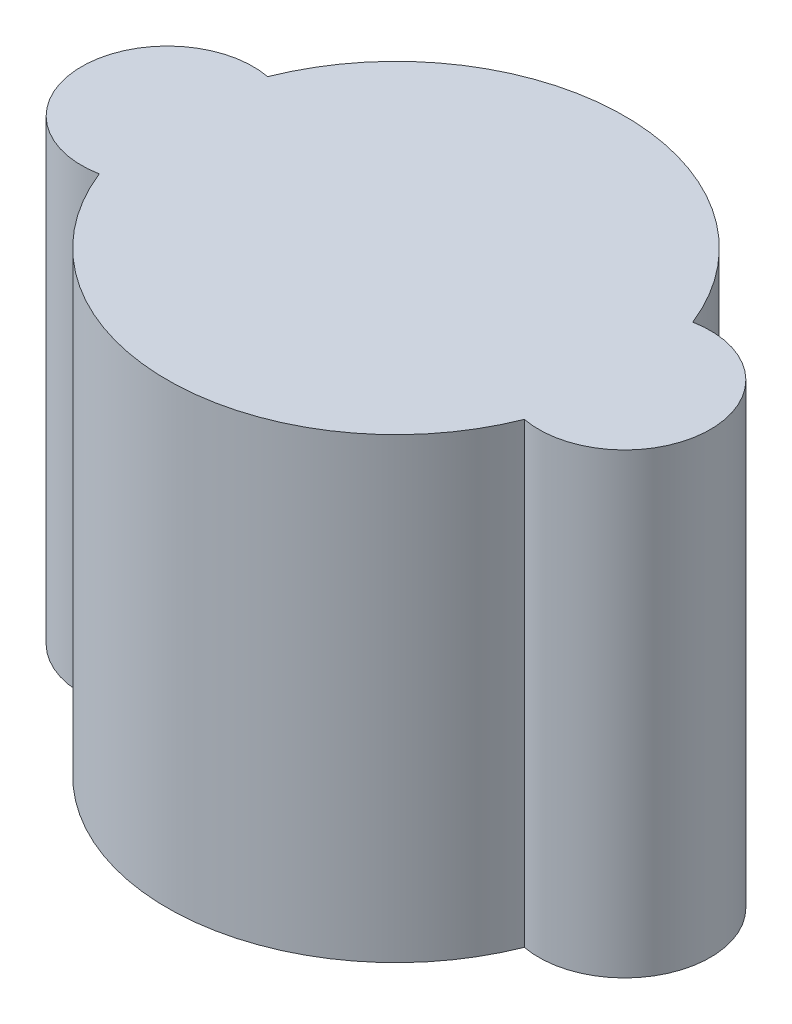
ISO-10303-21;
HEADER;
FILE_DESCRIPTION(('STEP AP214'),'2;1');
FILE_NAME('part.step','',(''),(''),'','','');
FILE_SCHEMA(('AUTOMOTIVE_DESIGN { 1 0 10303 214 1 1 1 1 }'));
ENDSEC;
DATA;
#1=APPLICATION_CONTEXT('core data for automotive mechanical design processes');
#2=APPLICATION_PROTOCOL_DEFINITION('international standard','automotive_design',2000,#1);
#3=PRODUCT_CONTEXT('',#1,'mechanical');
#4=PRODUCT('Part','Part','',(#3));
#5=PRODUCT_RELATED_PRODUCT_CATEGORY('part','',(#4));
#6=PRODUCT_DEFINITION_FORMATION('','',#4);
#7=PRODUCT_DEFINITION_CONTEXT('part definition',#1,'design');
#8=PRODUCT_DEFINITION('design','',#6,#7);
#9=PRODUCT_DEFINITION_SHAPE('','',#8);
#10=(LENGTH_UNIT() NAMED_UNIT(*) SI_UNIT(.MILLI.,.METRE.));
#11=(NAMED_UNIT(*) PLANE_ANGLE_UNIT() SI_UNIT($,.RADIAN.));
#12=(NAMED_UNIT(*) SI_UNIT($,.STERADIAN.) SOLID_ANGLE_UNIT());
#13=UNCERTAINTY_MEASURE_WITH_UNIT(LENGTH_MEASURE(1.E-05),#10,'distance_accuracy_value','');
#14=(GEOMETRIC_REPRESENTATION_CONTEXT(3) GLOBAL_UNCERTAINTY_ASSIGNED_CONTEXT((#13)) GLOBAL_UNIT_ASSIGNED_CONTEXT((#10,
#11,#12)) REPRESENTATION_CONTEXT('',''));
#15=CARTESIAN_POINT('',(0.,0.,0.));
#16=DIRECTION('',(0.,0.,1.));
#17=DIRECTION('',(1.,0.,0.));
#18=AXIS2_PLACEMENT_3D('',#15,#16,#17);
#19=CARTESIAN_POINT('',(0.,16.,0.));
#20=DIRECTION('',(0.,-1.,0.));
#21=DIRECTION('',(0.,0.,-1.));
#22=AXIS2_PLACEMENT_3D('',#19,#20,#21);
#23=CYLINDRICAL_SURFACE('',#22,8.);
#24=CARTESIAN_POINT('',(0.,0.,0.));
#25=DIRECTION('',(0.,1.,0.));
#26=DIRECTION('',(0.,0.,1.));
#27=AXIS2_PLACEMENT_3D('',#24,#25,#26);
#28=CIRCLE('',#27,8.);
#29=CARTESIAN_POINT('',(-7.4375,0.,2.94679380853157));
#30=VERTEX_POINT('',#29);
#31=CARTESIAN_POINT('',(7.4375,0.,2.94679380853157));
#32=VERTEX_POINT('',#31);
#33=EDGE_CURVE('E113',#30,#32,#28,.T.);
#34=ORIENTED_EDGE('',*,*,#33,.T.);
#35=DIRECTION('',(0.,-1.,0.));
#36=VECTOR('',#35,1.);
#37=CARTESIAN_POINT('',(7.4375,16.,2.94679380853157));
#38=LINE('',#37,#36);
#39=CARTESIAN_POINT('',(7.4375,16.,2.94679380853157));
#40=VERTEX_POINT('',#39);
#41=EDGE_CURVE('E63',#40,#32,#38,.T.);
#42=ORIENTED_EDGE('',*,*,#41,.F.);
#43=CARTESIAN_POINT('',(0.,16.,0.));
#44=DIRECTION('',(0.,1.,0.));
#45=DIRECTION('',(0.,0.,1.));
#46=AXIS2_PLACEMENT_3D('',#43,#44,#45);
#47=CIRCLE('',#46,8.);
#48=CARTESIAN_POINT('',(-7.4375,16.,2.94679380853157));
#49=VERTEX_POINT('',#48);
#50=EDGE_CURVE('E101',#49,#40,#47,.T.);
#51=ORIENTED_EDGE('',*,*,#50,.F.);
#52=DIRECTION('',(0.,-1.,0.));
#53=VECTOR('',#52,1.);
#54=CARTESIAN_POINT('',(-7.4375,16.,2.94679380853157));
#55=LINE('',#54,#53);
#56=EDGE_CURVE('E12',#49,#30,#55,.T.);
#57=ORIENTED_EDGE('',*,*,#56,.T.);
#58=EDGE_LOOP('',(#34,#42,#51,#57));
#59=FACE_BOUND('',#58,.T.);
#60=ADVANCED_FACE('F53',(#59),#23,.T.);
#61=CARTESIAN_POINT('',(8.,16.,0.));
#62=DIRECTION('',(0.,-1.,0.));
#63=DIRECTION('',(0.,0.,-1.));
#64=AXIS2_PLACEMENT_3D('',#61,#62,#63);
#65=CYLINDRICAL_SURFACE('',#64,3.);
#66=CARTESIAN_POINT('',(8.,0.,0.));
#67=DIRECTION('',(0.,1.,0.));
#68=DIRECTION('',(0.,0.,1.));
#69=AXIS2_PLACEMENT_3D('',#66,#67,#68);
#70=CIRCLE('',#69,3.);
#71=CARTESIAN_POINT('',(7.4375,0.,-2.94679380853157));
#72=VERTEX_POINT('',#71);
#73=EDGE_CURVE('E89',#32,#72,#70,.T.);
#74=ORIENTED_EDGE('',*,*,#73,.T.);
#75=DIRECTION('',(0.,-1.,0.));
#76=VECTOR('',#75,1.);
#77=CARTESIAN_POINT('',(7.4375,16.,-2.94679380853157));
#78=LINE('',#77,#76);
#79=CARTESIAN_POINT('',(7.4375,16.,-2.94679380853157));
#80=VERTEX_POINT('',#79);
#81=EDGE_CURVE('E114',#80,#72,#78,.T.);
#82=ORIENTED_EDGE('',*,*,#81,.F.);
#83=CARTESIAN_POINT('',(8.,16.,0.));
#84=DIRECTION('',(0.,1.,0.));
#85=DIRECTION('',(0.,0.,1.));
#86=AXIS2_PLACEMENT_3D('',#83,#84,#85);
#87=CIRCLE('',#86,3.);
#88=EDGE_CURVE('E106',#40,#80,#87,.T.);
#89=ORIENTED_EDGE('',*,*,#88,.F.);
#90=ORIENTED_EDGE('',*,*,#41,.T.);
#91=EDGE_LOOP('',(#74,#82,#89,#90));
#92=FACE_BOUND('',#91,.T.);
#93=ADVANCED_FACE('F116',(#92),#65,.T.);
#94=CARTESIAN_POINT('',(-7.4375,0.,-2.94679380853157));
#95=VERTEX_POINT('',#94);
#96=EDGE_CURVE('E109',#72,#95,#28,.T.);
#97=ORIENTED_EDGE('',*,*,#96,.T.);
#98=DIRECTION('',(0.,-1.,0.));
#99=VECTOR('',#98,1.);
#100=CARTESIAN_POINT('',(-7.4375,16.,-2.94679380853157));
#101=LINE('',#100,#99);
#102=CARTESIAN_POINT('',(-7.4375,16.,-2.94679380853157));
#103=VERTEX_POINT('',#102);
#104=EDGE_CURVE('E72',#103,#95,#101,.T.);
#105=ORIENTED_EDGE('',*,*,#104,.F.);
#106=EDGE_CURVE('E111',#80,#103,#47,.T.);
#107=ORIENTED_EDGE('',*,*,#106,.F.);
#108=ORIENTED_EDGE('',*,*,#81,.T.);
#109=EDGE_LOOP('',(#97,#105,#107,#108));
#110=FACE_BOUND('',#109,.T.);
#111=ADVANCED_FACE('F125',(#110),#23,.T.);
#112=CARTESIAN_POINT('',(0.,0.,0.));
#113=DIRECTION('',(0.,1.,0.));
#114=DIRECTION('',(0.,0.,1.));
#115=AXIS2_PLACEMENT_3D('',#112,#113,#114);
#116=PLANE('',#115);
#117=ORIENTED_EDGE('',*,*,#33,.F.);
#118=CARTESIAN_POINT('',(-8.,0.,0.));
#119=DIRECTION('',(0.,1.,0.));
#120=DIRECTION('',(0.,0.,1.));
#121=AXIS2_PLACEMENT_3D('',#118,#119,#120);
#122=CIRCLE('',#121,3.);
#123=EDGE_CURVE('E57',#95,#30,#122,.T.);
#124=ORIENTED_EDGE('',*,*,#123,.F.);
#125=ORIENTED_EDGE('',*,*,#96,.F.);
#126=ORIENTED_EDGE('',*,*,#73,.F.);
#127=EDGE_LOOP('',(#117,#124,#125,#126));
#128=FACE_BOUND('',#127,.T.);
#129=ADVANCED_FACE('F124',(#128),#116,.F.);
#130=CARTESIAN_POINT('',(0.,16.,0.));
#131=DIRECTION('',(0.,1.,0.));
#132=DIRECTION('',(0.,0.,1.));
#133=AXIS2_PLACEMENT_3D('',#130,#131,#132);
#134=PLANE('',#133);
#135=ORIENTED_EDGE('',*,*,#106,.T.);
#136=CARTESIAN_POINT('',(-8.,16.,0.));
#137=DIRECTION('',(0.,1.,0.));
#138=DIRECTION('',(0.,0.,1.));
#139=AXIS2_PLACEMENT_3D('',#136,#137,#138);
#140=CIRCLE('',#139,3.);
#141=EDGE_CURVE('E107',#103,#49,#140,.T.);
#142=ORIENTED_EDGE('',*,*,#141,.T.);
#143=ORIENTED_EDGE('',*,*,#50,.T.);
#144=ORIENTED_EDGE('',*,*,#88,.T.);
#145=EDGE_LOOP('',(#135,#142,#143,#144));
#146=FACE_BOUND('',#145,.T.);
#147=ADVANCED_FACE('F104',(#146),#134,.T.);
#148=CARTESIAN_POINT('',(-8.,16.,0.));
#149=DIRECTION('',(0.,-1.,0.));
#150=DIRECTION('',(0.,0.,-1.));
#151=AXIS2_PLACEMENT_3D('',#148,#149,#150);
#152=CYLINDRICAL_SURFACE('',#151,3.);
#153=ORIENTED_EDGE('',*,*,#123,.T.);
#154=ORIENTED_EDGE('',*,*,#56,.F.);
#155=ORIENTED_EDGE('',*,*,#141,.F.);
#156=ORIENTED_EDGE('',*,*,#104,.T.);
#157=EDGE_LOOP('',(#153,#154,#155,#156));
#158=FACE_BOUND('',#157,.T.);
#159=ADVANCED_FACE('F55',(#158),#152,.T.);
#160=CLOSED_SHELL('',(#60,#93,#111,#129,#147,#159));
#161=MANIFOLD_SOLID_BREP('B2',#160);
#162=ADVANCED_BREP_SHAPE_REPRESENTATION('',(#18,#161),#14);
#163=SHAPE_DEFINITION_REPRESENTATION(#9,#162);
ENDSEC;
END-ISO-10303-21;
